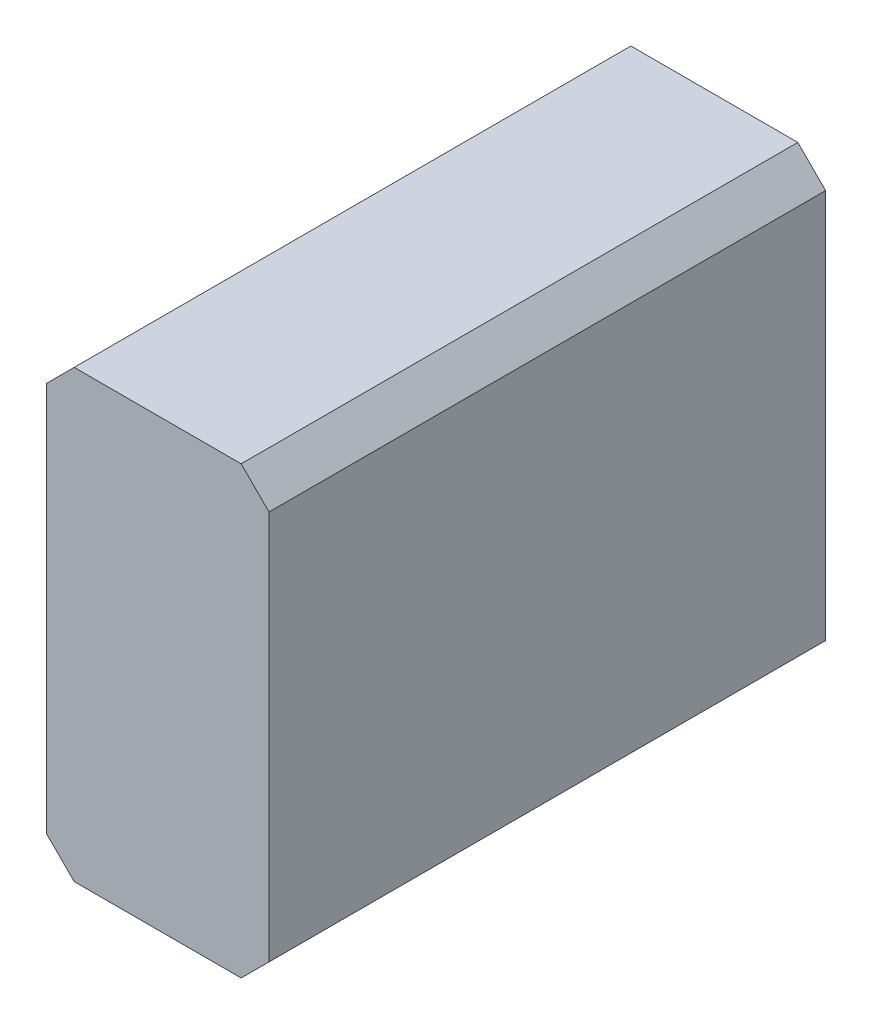
ISO-10303-21;
HEADER;
FILE_DESCRIPTION(('STEP AP214'),'2;1');
FILE_NAME('part.step','',(''),(''),'','','');
FILE_SCHEMA(('AUTOMOTIVE_DESIGN { 1 0 10303 214 1 1 1 1 }'));
ENDSEC;
DATA;
#1=APPLICATION_CONTEXT('core data for automotive mechanical design processes');
#2=APPLICATION_PROTOCOL_DEFINITION('international standard','automotive_design',2000,#1);
#3=PRODUCT_CONTEXT('',#1,'mechanical');
#4=PRODUCT('Part','Part','',(#3));
#5=PRODUCT_RELATED_PRODUCT_CATEGORY('part','',(#4));
#6=PRODUCT_DEFINITION_FORMATION('','',#4);
#7=PRODUCT_DEFINITION_CONTEXT('part definition',#1,'design');
#8=PRODUCT_DEFINITION('design','',#6,#7);
#9=PRODUCT_DEFINITION_SHAPE('','',#8);
#10=(LENGTH_UNIT() NAMED_UNIT(*) SI_UNIT(.MILLI.,.METRE.));
#11=(NAMED_UNIT(*) PLANE_ANGLE_UNIT() SI_UNIT($,.RADIAN.));
#12=(NAMED_UNIT(*) SI_UNIT($,.STERADIAN.) SOLID_ANGLE_UNIT());
#13=UNCERTAINTY_MEASURE_WITH_UNIT(LENGTH_MEASURE(1.E-05),#10,'distance_accuracy_value','');
#14=(GEOMETRIC_REPRESENTATION_CONTEXT(3) GLOBAL_UNCERTAINTY_ASSIGNED_CONTEXT((#13)) GLOBAL_UNIT_ASSIGNED_CONTEXT((#10,
#11,#12)) REPRESENTATION_CONTEXT('',''));
#15=CARTESIAN_POINT('',(0.,0.,0.));
#16=DIRECTION('',(0.,0.,1.));
#17=DIRECTION('',(1.,0.,0.));
#18=AXIS2_PLACEMENT_3D('',#15,#16,#17);
#19=CARTESIAN_POINT('',(2.,4.,10.));
#20=DIRECTION('',(-1.,0.,0.));
#21=DIRECTION('',(0.,-1.,0.));
#22=AXIS2_PLACEMENT_3D('',#19,#20,#21);
#23=PLANE('',#22);
#24=DIRECTION('',(0.,1.,0.));
#25=VECTOR('',#24,1.);
#26=CARTESIAN_POINT('',(2.,4.,10.));
#27=LINE('',#26,#25);
#28=CARTESIAN_POINT('',(2.,-3.5,10.));
#29=VERTEX_POINT('',#28);
#30=CARTESIAN_POINT('',(2.,3.5,10.));
#31=VERTEX_POINT('',#30);
#32=EDGE_CURVE('E128',#29,#31,#27,.T.);
#33=ORIENTED_EDGE('',*,*,#32,.F.);
#34=DIRECTION('',(0.,0.,-1.));
#35=VECTOR('',#34,1.);
#36=CARTESIAN_POINT('',(2.,-3.5,10.));
#37=LINE('',#36,#35);
#38=CARTESIAN_POINT('',(2.,-3.5,0.));
#39=VERTEX_POINT('',#38);
#40=EDGE_CURVE('E154',#29,#39,#37,.T.);
#41=ORIENTED_EDGE('',*,*,#40,.T.);
#42=DIRECTION('',(0.,1.,0.));
#43=VECTOR('',#42,1.);
#44=CARTESIAN_POINT('',(2.,4.,0.));
#45=LINE('',#44,#43);
#46=CARTESIAN_POINT('',(2.,3.5,0.));
#47=VERTEX_POINT('',#46);
#48=EDGE_CURVE('E160',#39,#47,#45,.T.);
#49=ORIENTED_EDGE('',*,*,#48,.T.);
#50=DIRECTION('',(0.,0.,1.));
#51=VECTOR('',#50,1.);
#52=CARTESIAN_POINT('',(2.,3.5,10.));
#53=LINE('',#52,#51);
#54=EDGE_CURVE('E152',#47,#31,#53,.T.);
#55=ORIENTED_EDGE('',*,*,#54,.T.);
#56=EDGE_LOOP('',(#33,#41,#49,#55));
#57=FACE_BOUND('',#56,.T.);
#58=ADVANCED_FACE('F35',(#57),#23,.F.);
#59=CARTESIAN_POINT('',(-2.,4.,10.));
#60=DIRECTION('',(0.,-1.,0.));
#61=DIRECTION('',(0.,0.,-1.));
#62=AXIS2_PLACEMENT_3D('',#59,#60,#61);
#63=PLANE('',#62);
#64=DIRECTION('',(-1.,0.,0.));
#65=VECTOR('',#64,1.);
#66=CARTESIAN_POINT('',(-2.,4.,10.));
#67=LINE('',#66,#65);
#68=CARTESIAN_POINT('',(1.5,4.,10.));
#69=VERTEX_POINT('',#68);
#70=CARTESIAN_POINT('',(-1.5,4.,10.));
#71=VERTEX_POINT('',#70);
#72=EDGE_CURVE('E131',#69,#71,#67,.T.);
#73=ORIENTED_EDGE('',*,*,#72,.F.);
#74=DIRECTION('',(0.,0.,-1.));
#75=VECTOR('',#74,1.);
#76=CARTESIAN_POINT('',(1.5,4.,10.));
#77=LINE('',#76,#75);
#78=CARTESIAN_POINT('',(1.5,4.,0.));
#79=VERTEX_POINT('',#78);
#80=EDGE_CURVE('E11',#69,#79,#77,.T.);
#81=ORIENTED_EDGE('',*,*,#80,.T.);
#82=DIRECTION('',(-1.,0.,0.));
#83=VECTOR('',#82,1.);
#84=CARTESIAN_POINT('',(-2.,4.,0.));
#85=LINE('',#84,#83);
#86=CARTESIAN_POINT('',(-1.5,4.,0.));
#87=VERTEX_POINT('',#86);
#88=EDGE_CURVE('E133',#79,#87,#85,.T.);
#89=ORIENTED_EDGE('',*,*,#88,.T.);
#90=DIRECTION('',(0.,0.,1.));
#91=VECTOR('',#90,1.);
#92=CARTESIAN_POINT('',(-1.5,4.,10.));
#93=LINE('',#92,#91);
#94=EDGE_CURVE('E44',#87,#71,#93,.T.);
#95=ORIENTED_EDGE('',*,*,#94,.T.);
#96=EDGE_LOOP('',(#73,#81,#89,#95));
#97=FACE_BOUND('',#96,.T.);
#98=ADVANCED_FACE('F179',(#97),#63,.F.);
#99=CARTESIAN_POINT('',(-2.,4.,10.));
#100=DIRECTION('',(1.,0.,0.));
#101=DIRECTION('',(0.,1.,0.));
#102=AXIS2_PLACEMENT_3D('',#99,#100,#101);
#103=PLANE('',#102);
#104=DIRECTION('',(0.,-1.,0.));
#105=VECTOR('',#104,1.);
#106=CARTESIAN_POINT('',(-2.,4.,0.));
#107=LINE('',#106,#105);
#108=CARTESIAN_POINT('',(-2.,3.5,0.));
#109=VERTEX_POINT('',#108);
#110=CARTESIAN_POINT('',(-2.,-3.5,0.));
#111=VERTEX_POINT('',#110);
#112=EDGE_CURVE('E129',#109,#111,#107,.T.);
#113=ORIENTED_EDGE('',*,*,#112,.T.);
#114=DIRECTION('',(0.,0.,1.));
#115=VECTOR('',#114,1.);
#116=CARTESIAN_POINT('',(-2.,-3.5,10.));
#117=LINE('',#116,#115);
#118=CARTESIAN_POINT('',(-2.,-3.5,10.));
#119=VERTEX_POINT('',#118);
#120=EDGE_CURVE('E107',#111,#119,#117,.T.);
#121=ORIENTED_EDGE('',*,*,#120,.T.);
#122=DIRECTION('',(0.,-1.,0.));
#123=VECTOR('',#122,1.);
#124=CARTESIAN_POINT('',(-2.,4.,10.));
#125=LINE('',#124,#123);
#126=CARTESIAN_POINT('',(-2.,3.5,10.));
#127=VERTEX_POINT('',#126);
#128=EDGE_CURVE('E168',#127,#119,#125,.T.);
#129=ORIENTED_EDGE('',*,*,#128,.F.);
#130=DIRECTION('',(0.,0.,-1.));
#131=VECTOR('',#130,1.);
#132=CARTESIAN_POINT('',(-2.,3.5,10.));
#133=LINE('',#132,#131);
#134=EDGE_CURVE('E112',#127,#109,#133,.T.);
#135=ORIENTED_EDGE('',*,*,#134,.T.);
#136=EDGE_LOOP('',(#113,#121,#129,#135));
#137=FACE_BOUND('',#136,.T.);
#138=ADVANCED_FACE('F178',(#137),#103,.F.);
#139=CARTESIAN_POINT('',(-2.,-4.,10.));
#140=DIRECTION('',(0.,1.,0.));
#141=DIRECTION('',(0.,0.,1.));
#142=AXIS2_PLACEMENT_3D('',#139,#140,#141);
#143=PLANE('',#142);
#144=DIRECTION('',(1.,0.,0.));
#145=VECTOR('',#144,1.);
#146=CARTESIAN_POINT('',(-2.,-4.,10.));
#147=LINE('',#146,#145);
#148=CARTESIAN_POINT('',(-1.5,-4.,10.));
#149=VERTEX_POINT('',#148);
#150=CARTESIAN_POINT('',(1.5,-4.,10.));
#151=VERTEX_POINT('',#150);
#152=EDGE_CURVE('E122',#149,#151,#147,.T.);
#153=ORIENTED_EDGE('',*,*,#152,.F.);
#154=DIRECTION('',(0.,0.,-1.));
#155=VECTOR('',#154,1.);
#156=CARTESIAN_POINT('',(-1.5,-4.,10.));
#157=LINE('',#156,#155);
#158=CARTESIAN_POINT('',(-1.5,-4.,0.));
#159=VERTEX_POINT('',#158);
#160=EDGE_CURVE('E106',#149,#159,#157,.T.);
#161=ORIENTED_EDGE('',*,*,#160,.T.);
#162=DIRECTION('',(1.,0.,0.));
#163=VECTOR('',#162,1.);
#164=CARTESIAN_POINT('',(-2.,-4.,0.));
#165=LINE('',#164,#163);
#166=CARTESIAN_POINT('',(1.5,-4.,0.));
#167=VERTEX_POINT('',#166);
#168=EDGE_CURVE('E119',#159,#167,#165,.T.);
#169=ORIENTED_EDGE('',*,*,#168,.T.);
#170=DIRECTION('',(0.,0.,1.));
#171=VECTOR('',#170,1.);
#172=CARTESIAN_POINT('',(1.5,-4.,10.));
#173=LINE('',#172,#171);
#174=EDGE_CURVE('E124',#167,#151,#173,.T.);
#175=ORIENTED_EDGE('',*,*,#174,.T.);
#176=EDGE_LOOP('',(#153,#161,#169,#175));
#177=FACE_BOUND('',#176,.T.);
#178=ADVANCED_FACE('F118',(#177),#143,.F.);
#179=CARTESIAN_POINT('',(0.,0.,10.));
#180=DIRECTION('',(0.,0.,1.));
#181=DIRECTION('',(1.,0.,0.));
#182=AXIS2_PLACEMENT_3D('',#179,#180,#181);
#183=PLANE('',#182);
#184=ORIENTED_EDGE('',*,*,#128,.T.);
#185=DIRECTION('',(-0.707106781186546,0.707106781186549,0.));
#186=VECTOR('',#185,1.);
#187=CARTESIAN_POINT('',(-2.75,-2.74999999999999,10.));
#188=LINE('',#187,#186);
#189=EDGE_CURVE('E150',#119,#149,#188,.F.);
#190=ORIENTED_EDGE('',*,*,#189,.T.);
#191=ORIENTED_EDGE('',*,*,#152,.T.);
#192=DIRECTION('',(-0.707106781186549,-0.707106781186546,0.));
#193=VECTOR('',#192,1.);
#194=CARTESIAN_POINT('',(2.75,-2.75000000000001,10.));
#195=LINE('',#194,#193);
#196=EDGE_CURVE('E148',#151,#29,#195,.F.);
#197=ORIENTED_EDGE('',*,*,#196,.T.);
#198=ORIENTED_EDGE('',*,*,#32,.T.);
#199=DIRECTION('',(0.707106781186546,-0.707106781186549,0.));
#200=VECTOR('',#199,1.);
#201=CARTESIAN_POINT('',(2.75,2.75,10.));
#202=LINE('',#201,#200);
#203=EDGE_CURVE('E57',#31,#69,#202,.F.);
#204=ORIENTED_EDGE('',*,*,#203,.T.);
#205=ORIENTED_EDGE('',*,*,#72,.T.);
#206=DIRECTION('',(0.707106781186549,0.707106781186546,0.));
#207=VECTOR('',#206,1.);
#208=CARTESIAN_POINT('',(-2.75,2.75000000000001,10.));
#209=LINE('',#208,#207);
#210=EDGE_CURVE('E145',#71,#127,#209,.F.);
#211=ORIENTED_EDGE('',*,*,#210,.T.);
#212=EDGE_LOOP('',(#184,#190,#191,#197,#198,#204,#205,#211));
#213=FACE_BOUND('',#212,.T.);
#214=ADVANCED_FACE('F172',(#213),#183,.T.);
#215=CARTESIAN_POINT('',(0.,0.,0.));
#216=DIRECTION('',(0.,0.,1.));
#217=DIRECTION('',(1.,0.,0.));
#218=AXIS2_PLACEMENT_3D('',#215,#216,#217);
#219=PLANE('',#218);
#220=ORIENTED_EDGE('',*,*,#168,.F.);
#221=DIRECTION('',(0.707106781186546,-0.707106781186549,0.));
#222=VECTOR('',#221,1.);
#223=CARTESIAN_POINT('',(-1.5,-4.,0.));
#224=LINE('',#223,#222);
#225=EDGE_CURVE('E102',#159,#111,#224,.F.);
#226=ORIENTED_EDGE('',*,*,#225,.T.);
#227=ORIENTED_EDGE('',*,*,#112,.F.);
#228=DIRECTION('',(-0.707106781186549,-0.707106781186546,0.));
#229=VECTOR('',#228,1.);
#230=CARTESIAN_POINT('',(-2.,3.5,0.));
#231=LINE('',#230,#229);
#232=EDGE_CURVE('E123',#109,#87,#231,.F.);
#233=ORIENTED_EDGE('',*,*,#232,.T.);
#234=ORIENTED_EDGE('',*,*,#88,.F.);
#235=DIRECTION('',(-0.707106781186546,0.707106781186549,0.));
#236=VECTOR('',#235,1.);
#237=CARTESIAN_POINT('',(1.5,4.,0.));
#238=LINE('',#237,#236);
#239=EDGE_CURVE('E139',#79,#47,#238,.F.);
#240=ORIENTED_EDGE('',*,*,#239,.T.);
#241=ORIENTED_EDGE('',*,*,#48,.F.);
#242=DIRECTION('',(0.707106781186549,0.707106781186546,0.));
#243=VECTOR('',#242,1.);
#244=CARTESIAN_POINT('',(2.,-3.5,0.));
#245=LINE('',#244,#243);
#246=EDGE_CURVE('E113',#39,#167,#245,.F.);
#247=ORIENTED_EDGE('',*,*,#246,.T.);
#248=EDGE_LOOP('',(#220,#226,#227,#233,#234,#240,#241,#247));
#249=FACE_BOUND('',#248,.T.);
#250=ADVANCED_FACE('F126',(#249),#219,.F.);
#251=CARTESIAN_POINT('',(-1.5,-4.,10.));
#252=DIRECTION('',(0.707106781186549,0.707106781186546,0.));
#253=DIRECTION('',(0.,0.,-1.));
#254=AXIS2_PLACEMENT_3D('',#251,#252,#253);
#255=PLANE('',#254);
#256=ORIENTED_EDGE('',*,*,#189,.F.);
#257=ORIENTED_EDGE('',*,*,#120,.F.);
#258=ORIENTED_EDGE('',*,*,#225,.F.);
#259=ORIENTED_EDGE('',*,*,#160,.F.);
#260=EDGE_LOOP('',(#256,#257,#258,#259));
#261=FACE_BOUND('',#260,.T.);
#262=ADVANCED_FACE('F105',(#261),#255,.F.);
#263=CARTESIAN_POINT('',(2.,-3.5,10.));
#264=DIRECTION('',(-0.707106781186546,0.707106781186549,0.));
#265=DIRECTION('',(0.,0.,-1.));
#266=AXIS2_PLACEMENT_3D('',#263,#264,#265);
#267=PLANE('',#266);
#268=ORIENTED_EDGE('',*,*,#196,.F.);
#269=ORIENTED_EDGE('',*,*,#174,.F.);
#270=ORIENTED_EDGE('',*,*,#246,.F.);
#271=ORIENTED_EDGE('',*,*,#40,.F.);
#272=EDGE_LOOP('',(#268,#269,#270,#271));
#273=FACE_BOUND('',#272,.T.);
#274=ADVANCED_FACE('F182',(#273),#267,.F.);
#275=CARTESIAN_POINT('',(1.5,4.,10.));
#276=DIRECTION('',(-0.707106781186549,-0.707106781186546,0.));
#277=DIRECTION('',(0.,0.,-1.));
#278=AXIS2_PLACEMENT_3D('',#275,#276,#277);
#279=PLANE('',#278);
#280=ORIENTED_EDGE('',*,*,#203,.F.);
#281=ORIENTED_EDGE('',*,*,#54,.F.);
#282=ORIENTED_EDGE('',*,*,#239,.F.);
#283=ORIENTED_EDGE('',*,*,#80,.F.);
#284=EDGE_LOOP('',(#280,#281,#282,#283));
#285=FACE_BOUND('',#284,.T.);
#286=ADVANCED_FACE('F181',(#285),#279,.F.);
#287=CARTESIAN_POINT('',(-2.,3.5,10.));
#288=DIRECTION('',(0.707106781186546,-0.707106781186549,0.));
#289=DIRECTION('',(0.,0.,-1.));
#290=AXIS2_PLACEMENT_3D('',#287,#288,#289);
#291=PLANE('',#290);
#292=ORIENTED_EDGE('',*,*,#210,.F.);
#293=ORIENTED_EDGE('',*,*,#94,.F.);
#294=ORIENTED_EDGE('',*,*,#232,.F.);
#295=ORIENTED_EDGE('',*,*,#134,.F.);
#296=EDGE_LOOP('',(#292,#293,#294,#295));
#297=FACE_BOUND('',#296,.T.);
#298=ADVANCED_FACE('F38',(#297),#291,.F.);
#299=CLOSED_SHELL('',(#58,#98,#138,#178,#214,#250,#262,#274,#286,#298));
#300=MANIFOLD_SOLID_BREP('B2',#299);
#301=ADVANCED_BREP_SHAPE_REPRESENTATION('',(#18,#300),#14);
#302=SHAPE_DEFINITION_REPRESENTATION(#9,#301);
ENDSEC;
END-ISO-10303-21;
